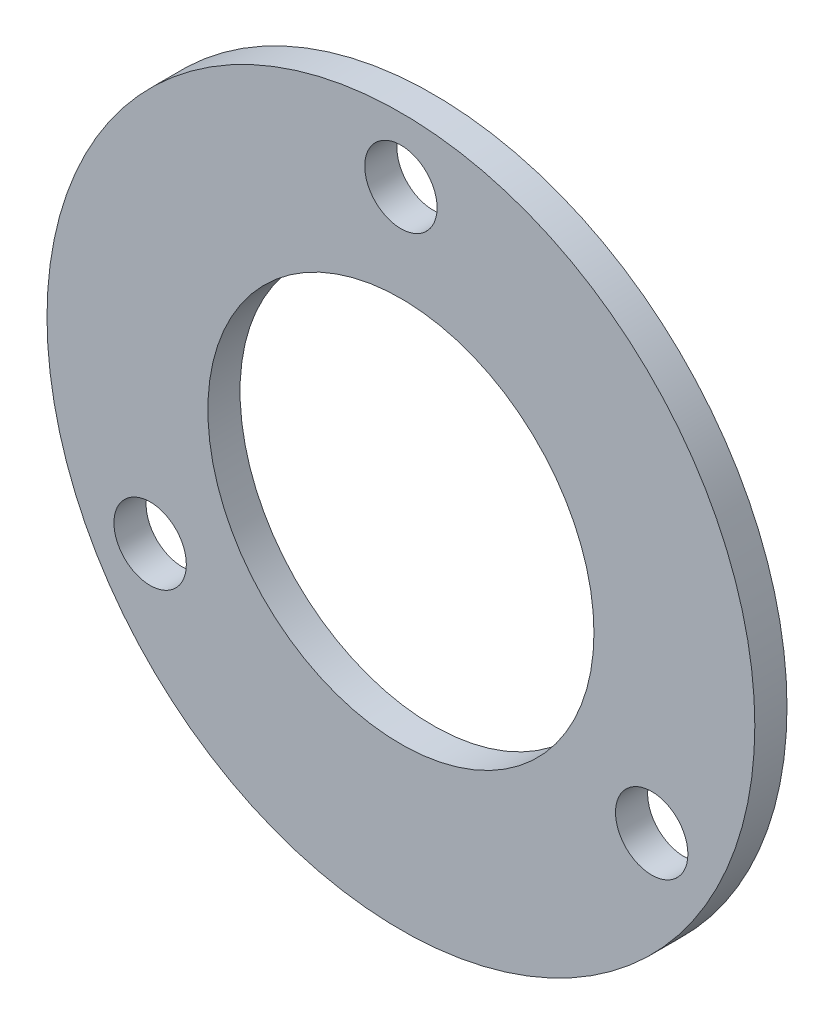
ISO-10303-21;
HEADER;
FILE_DESCRIPTION(('STEP AP214'),'2;1');
FILE_NAME('part.step','',(''),(''),'','','');
FILE_SCHEMA(('AUTOMOTIVE_DESIGN { 1 0 10303 214 1 1 1 1 }'));
ENDSEC;
DATA;
#1=APPLICATION_CONTEXT('core data for automotive mechanical design processes');
#2=APPLICATION_PROTOCOL_DEFINITION('international standard','automotive_design',2000,#1);
#3=PRODUCT_CONTEXT('',#1,'mechanical');
#4=PRODUCT('Part','Part','',(#3));
#5=PRODUCT_RELATED_PRODUCT_CATEGORY('part','',(#4));
#6=PRODUCT_DEFINITION_FORMATION('','',#4);
#7=PRODUCT_DEFINITION_CONTEXT('part definition',#1,'design');
#8=PRODUCT_DEFINITION('design','',#6,#7);
#9=PRODUCT_DEFINITION_SHAPE('','',#8);
#10=(LENGTH_UNIT() NAMED_UNIT(*) SI_UNIT(.MILLI.,.METRE.));
#11=(NAMED_UNIT(*) PLANE_ANGLE_UNIT() SI_UNIT($,.RADIAN.));
#12=(NAMED_UNIT(*) SI_UNIT($,.STERADIAN.) SOLID_ANGLE_UNIT());
#13=UNCERTAINTY_MEASURE_WITH_UNIT(LENGTH_MEASURE(1.E-05),#10,'distance_accuracy_value','');
#14=(GEOMETRIC_REPRESENTATION_CONTEXT(3) GLOBAL_UNCERTAINTY_ASSIGNED_CONTEXT((#13)) GLOBAL_UNIT_ASSIGNED_CONTEXT((#10,
#11,#12)) REPRESENTATION_CONTEXT('',''));
#15=CARTESIAN_POINT('',(0.,0.,0.));
#16=DIRECTION('',(0.,0.,1.));
#17=DIRECTION('',(1.,0.,0.));
#18=AXIS2_PLACEMENT_3D('',#15,#16,#17);
#19=CARTESIAN_POINT('',(0.,0.,1.));
#20=DIRECTION('',(0.,0.,1.));
#21=DIRECTION('',(1.,0.,0.));
#22=AXIS2_PLACEMENT_3D('',#19,#20,#21);
#23=PLANE('',#22);
#24=CARTESIAN_POINT('',(15.588457268121,-8.99999999999934,1.));
#25=DIRECTION('',(0.,0.,1.));
#26=DIRECTION('',(1.,0.,0.));
#27=AXIS2_PLACEMENT_3D('',#24,#25,#26);
#28=CIRCLE('',#27,2.25000000000098);
#29=CARTESIAN_POINT('',(17.838457268122,-8.99999999999934,1.));
#30=VERTEX_POINT('',#29);
#31=EDGE_CURVE('E89',#30,#30,#28,.T.);
#32=ORIENTED_EDGE('',*,*,#31,.F.);
#33=EDGE_LOOP('',(#32));
#34=FACE_BOUND('',#33,.T.);
#35=CARTESIAN_POINT('',(-15.5884572681187,-9.00000000000067,1.));
#36=DIRECTION('',(0.,0.,1.));
#37=DIRECTION('',(1.,0.,0.));
#38=AXIS2_PLACEMENT_3D('',#35,#36,#37);
#39=CIRCLE('',#38,2.25000000000146);
#40=CARTESIAN_POINT('',(-13.3384572681173,-9.00000000000067,1.));
#41=VERTEX_POINT('',#40);
#42=EDGE_CURVE('E85',#41,#41,#39,.T.);
#43=ORIENTED_EDGE('',*,*,#42,.F.);
#44=EDGE_LOOP('',(#43));
#45=FACE_BOUND('',#44,.T.);
#46=CARTESIAN_POINT('',(0.,18.,1.));
#47=DIRECTION('',(0.,0.,1.));
#48=DIRECTION('',(1.,0.,0.));
#49=AXIS2_PLACEMENT_3D('',#46,#47,#48);
#50=CIRCLE('',#49,2.25);
#51=CARTESIAN_POINT('',(2.25,18.,1.));
#52=VERTEX_POINT('',#51);
#53=EDGE_CURVE('E77',#52,#52,#50,.T.);
#54=ORIENTED_EDGE('',*,*,#53,.F.);
#55=EDGE_LOOP('',(#54));
#56=FACE_BOUND('',#55,.T.);
#57=CARTESIAN_POINT('',(0.,0.,1.));
#58=DIRECTION('',(0.,0.,1.));
#59=DIRECTION('',(1.,0.,0.));
#60=AXIS2_PLACEMENT_3D('',#57,#58,#59);
#61=CIRCLE('',#60,22.);
#62=CARTESIAN_POINT('',(22.,0.,1.));
#63=VERTEX_POINT('',#62);
#64=EDGE_CURVE('E11',#63,#63,#61,.T.);
#65=ORIENTED_EDGE('',*,*,#64,.T.);
#66=EDGE_LOOP('',(#65));
#67=FACE_BOUND('',#66,.T.);
#68=CARTESIAN_POINT('',(0.,0.,1.));
#69=DIRECTION('',(0.,0.,1.));
#70=DIRECTION('',(1.,0.,0.));
#71=AXIS2_PLACEMENT_3D('',#68,#69,#70);
#72=CIRCLE('',#71,12.);
#73=CARTESIAN_POINT('',(12.,0.,1.));
#74=VERTEX_POINT('',#73);
#75=EDGE_CURVE('E63',#74,#74,#72,.T.);
#76=ORIENTED_EDGE('',*,*,#75,.F.);
#77=EDGE_LOOP('',(#76));
#78=FACE_BOUND('',#77,.T.);
#79=ADVANCED_FACE('F50',(#34,#45,#56,#67,#78),#23,.T.);
#80=CARTESIAN_POINT('',(0.,0.,-1.));
#81=DIRECTION('',(0.,0.,1.));
#82=DIRECTION('',(1.,0.,0.));
#83=AXIS2_PLACEMENT_3D('',#80,#81,#82);
#84=PLANE('',#83);
#85=CARTESIAN_POINT('',(15.588457268121,-8.99999999999934,-1.));
#86=DIRECTION('',(0.,0.,1.));
#87=DIRECTION('',(1.,0.,0.));
#88=AXIS2_PLACEMENT_3D('',#85,#86,#87);
#89=CIRCLE('',#88,2.25000000000098);
#90=CARTESIAN_POINT('',(17.838457268122,-8.99999999999934,-1.));
#91=VERTEX_POINT('',#90);
#92=EDGE_CURVE('E69',#91,#91,#89,.T.);
#93=ORIENTED_EDGE('',*,*,#92,.T.);
#94=EDGE_LOOP('',(#93));
#95=FACE_BOUND('',#94,.T.);
#96=CARTESIAN_POINT('',(-15.5884572681187,-9.00000000000067,-1.));
#97=DIRECTION('',(0.,0.,1.));
#98=DIRECTION('',(1.,0.,0.));
#99=AXIS2_PLACEMENT_3D('',#96,#97,#98);
#100=CIRCLE('',#99,2.25000000000146);
#101=CARTESIAN_POINT('',(-13.3384572681173,-9.00000000000067,-1.));
#102=VERTEX_POINT('',#101);
#103=EDGE_CURVE('E81',#102,#102,#100,.T.);
#104=ORIENTED_EDGE('',*,*,#103,.T.);
#105=EDGE_LOOP('',(#104));
#106=FACE_BOUND('',#105,.T.);
#107=CARTESIAN_POINT('',(0.,18.,-1.));
#108=DIRECTION('',(0.,0.,1.));
#109=DIRECTION('',(1.,0.,0.));
#110=AXIS2_PLACEMENT_3D('',#107,#108,#109);
#111=CIRCLE('',#110,2.25);
#112=CARTESIAN_POINT('',(2.25,18.,-1.));
#113=VERTEX_POINT('',#112);
#114=EDGE_CURVE('E73',#113,#113,#111,.T.);
#115=ORIENTED_EDGE('',*,*,#114,.T.);
#116=EDGE_LOOP('',(#115));
#117=FACE_BOUND('',#116,.T.);
#118=CARTESIAN_POINT('',(0.,0.,-1.));
#119=DIRECTION('',(0.,0.,1.));
#120=DIRECTION('',(1.,0.,0.));
#121=AXIS2_PLACEMENT_3D('',#118,#119,#120);
#122=CIRCLE('',#121,22.);
#123=CARTESIAN_POINT('',(22.,0.,-1.));
#124=VERTEX_POINT('',#123);
#125=EDGE_CURVE('E54',#124,#124,#122,.T.);
#126=ORIENTED_EDGE('',*,*,#125,.F.);
#127=EDGE_LOOP('',(#126));
#128=FACE_BOUND('',#127,.T.);
#129=CARTESIAN_POINT('',(0.,0.,-1.));
#130=DIRECTION('',(0.,0.,1.));
#131=DIRECTION('',(1.,0.,0.));
#132=AXIS2_PLACEMENT_3D('',#129,#130,#131);
#133=CIRCLE('',#132,12.);
#134=CARTESIAN_POINT('',(12.,0.,-1.));
#135=VERTEX_POINT('',#134);
#136=EDGE_CURVE('E65',#135,#135,#133,.T.);
#137=ORIENTED_EDGE('',*,*,#136,.T.);
#138=EDGE_LOOP('',(#137));
#139=FACE_BOUND('',#138,.T.);
#140=ADVANCED_FACE('F97',(#95,#106,#117,#128,#139),#84,.F.);
#141=CARTESIAN_POINT('',(0.,0.,1.));
#142=DIRECTION('',(0.,0.,-1.));
#143=DIRECTION('',(-1.,0.,0.));
#144=AXIS2_PLACEMENT_3D('',#141,#142,#143);
#145=CYLINDRICAL_SURFACE('',#144,22.);
#146=ORIENTED_EDGE('',*,*,#64,.F.);
#147=EDGE_LOOP('',(#146));
#148=FACE_BOUND('',#147,.T.);
#149=ORIENTED_EDGE('',*,*,#125,.T.);
#150=EDGE_LOOP('',(#149));
#151=FACE_BOUND('',#150,.T.);
#152=ADVANCED_FACE('F52',(#148,#151),#145,.T.);
#153=CARTESIAN_POINT('',(0.,0.,1.));
#154=DIRECTION('',(0.,0.,-1.));
#155=DIRECTION('',(-1.,0.,0.));
#156=AXIS2_PLACEMENT_3D('',#153,#154,#155);
#157=CYLINDRICAL_SURFACE('',#156,12.);
#158=ORIENTED_EDGE('',*,*,#75,.T.);
#159=EDGE_LOOP('',(#158));
#160=FACE_BOUND('',#159,.T.);
#161=ORIENTED_EDGE('',*,*,#136,.F.);
#162=EDGE_LOOP('',(#161));
#163=FACE_BOUND('',#162,.T.);
#164=ADVANCED_FACE('F116',(#160,#163),#157,.F.);
#165=CARTESIAN_POINT('',(0.,18.,-1.));
#166=DIRECTION('',(0.,0.,1.));
#167=DIRECTION('',(1.,0.,0.));
#168=AXIS2_PLACEMENT_3D('',#165,#166,#167);
#169=CYLINDRICAL_SURFACE('',#168,2.25);
#170=ORIENTED_EDGE('',*,*,#53,.T.);
#171=EDGE_LOOP('',(#170));
#172=FACE_BOUND('',#171,.T.);
#173=ORIENTED_EDGE('',*,*,#114,.F.);
#174=EDGE_LOOP('',(#173));
#175=FACE_BOUND('',#174,.T.);
#176=ADVANCED_FACE('F119',(#172,#175),#169,.F.);
#177=CARTESIAN_POINT('',(-15.5884572681187,-9.00000000000067,-1.));
#178=DIRECTION('',(0.,0.,1.));
#179=DIRECTION('',(1.,0.,0.));
#180=AXIS2_PLACEMENT_3D('',#177,#178,#179);
#181=CYLINDRICAL_SURFACE('',#180,2.25000000000146);
#182=ORIENTED_EDGE('',*,*,#103,.F.);
#183=EDGE_LOOP('',(#182));
#184=FACE_BOUND('',#183,.T.);
#185=ORIENTED_EDGE('',*,*,#42,.T.);
#186=EDGE_LOOP('',(#185));
#187=FACE_BOUND('',#186,.T.);
#188=ADVANCED_FACE('F103',(#184,#187),#181,.F.);
#189=CARTESIAN_POINT('',(15.588457268121,-8.99999999999934,-1.));
#190=DIRECTION('',(0.,0.,1.));
#191=DIRECTION('',(1.,0.,0.));
#192=AXIS2_PLACEMENT_3D('',#189,#190,#191);
#193=CYLINDRICAL_SURFACE('',#192,2.25000000000098);
#194=ORIENTED_EDGE('',*,*,#92,.F.);
#195=EDGE_LOOP('',(#194));
#196=FACE_BOUND('',#195,.T.);
#197=ORIENTED_EDGE('',*,*,#31,.T.);
#198=EDGE_LOOP('',(#197));
#199=FACE_BOUND('',#198,.T.);
#200=ADVANCED_FACE('F100',(#196,#199),#193,.F.);
#201=CLOSED_SHELL('',(#79,#140,#152,#164,#176,#188,#200));
#202=MANIFOLD_SOLID_BREP('B2',#201);
#203=ADVANCED_BREP_SHAPE_REPRESENTATION('',(#18,#202),#14);
#204=SHAPE_DEFINITION_REPRESENTATION(#9,#203);
ENDSEC;
END-ISO-10303-21;
